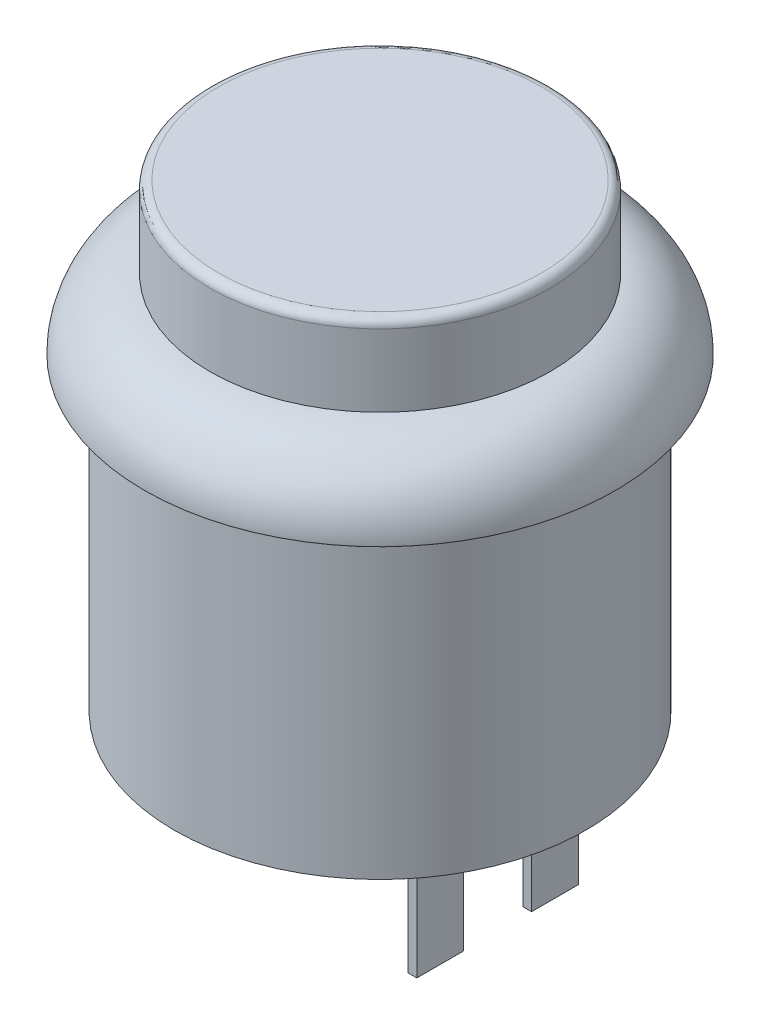
ISO-10303-21;
HEADER;
FILE_DESCRIPTION(('STEP AP214'),'2;1');
FILE_NAME('part.step','',(''),(''),'','','');
FILE_SCHEMA(('AUTOMOTIVE_DESIGN { 1 0 10303 214 1 1 1 1 }'));
ENDSEC;
DATA;
#1=APPLICATION_CONTEXT('core data for automotive mechanical design processes');
#2=APPLICATION_PROTOCOL_DEFINITION('international standard','automotive_design',2000,#1);
#3=PRODUCT_CONTEXT('',#1,'mechanical');
#4=PRODUCT('Part','Part','',(#3));
#5=PRODUCT_RELATED_PRODUCT_CATEGORY('part','',(#4));
#6=PRODUCT_DEFINITION_FORMATION('','',#4);
#7=PRODUCT_DEFINITION_CONTEXT('part definition',#1,'design');
#8=PRODUCT_DEFINITION('design','',#6,#7);
#9=PRODUCT_DEFINITION_SHAPE('','',#8);
#10=(LENGTH_UNIT() NAMED_UNIT(*) SI_UNIT(.MILLI.,.METRE.));
#11=(NAMED_UNIT(*) PLANE_ANGLE_UNIT() SI_UNIT($,.RADIAN.));
#12=(NAMED_UNIT(*) SI_UNIT($,.STERADIAN.) SOLID_ANGLE_UNIT());
#13=UNCERTAINTY_MEASURE_WITH_UNIT(LENGTH_MEASURE(1.E-05),#10,'distance_accuracy_value','');
#14=(GEOMETRIC_REPRESENTATION_CONTEXT(3) GLOBAL_UNCERTAINTY_ASSIGNED_CONTEXT((#13)) GLOBAL_UNIT_ASSIGNED_CONTEXT((#10,
#11,#12)) REPRESENTATION_CONTEXT('',''));
#15=CARTESIAN_POINT('',(0.,0.,0.));
#16=DIRECTION('',(0.,0.,1.));
#17=DIRECTION('',(1.,0.,0.));
#18=AXIS2_PLACEMENT_3D('',#15,#16,#17);
#19=CARTESIAN_POINT('',(0.,0.,0.));
#20=DIRECTION('',(0.,1.,0.));
#21=DIRECTION('',(0.,0.,1.));
#22=AXIS2_PLACEMENT_3D('',#19,#20,#21);
#23=PLANE('',#22);
#24=DIRECTION('',(0.,0.,-1.));
#25=VECTOR('',#24,1.);
#26=CARTESIAN_POINT('',(6.2,0.,4.605));
#27=LINE('',#26,#25);
#28=CARTESIAN_POINT('',(6.2,0.,4.605));
#29=VERTEX_POINT('',#28);
#30=CARTESIAN_POINT('',(6.2,0.,1.935));
#31=VERTEX_POINT('',#30);
#32=EDGE_CURVE('E131',#29,#31,#27,.T.);
#33=ORIENTED_EDGE('',*,*,#32,.F.);
#34=DIRECTION('',(-1.,0.,0.));
#35=VECTOR('',#34,1.);
#36=CARTESIAN_POINT('',(6.2,0.,4.605));
#37=LINE('',#36,#35);
#38=CARTESIAN_POINT('',(6.7,0.,4.605));
#39=VERTEX_POINT('',#38);
#40=EDGE_CURVE('E147',#39,#29,#37,.T.);
#41=ORIENTED_EDGE('',*,*,#40,.F.);
#42=DIRECTION('',(0.,0.,1.));
#43=VECTOR('',#42,1.);
#44=CARTESIAN_POINT('',(6.7,0.,4.605));
#45=LINE('',#44,#43);
#46=CARTESIAN_POINT('',(6.7,0.,1.935));
#47=VERTEX_POINT('',#46);
#48=EDGE_CURVE('E160',#47,#39,#45,.T.);
#49=ORIENTED_EDGE('',*,*,#48,.F.);
#50=DIRECTION('',(1.,0.,0.));
#51=VECTOR('',#50,1.);
#52=CARTESIAN_POINT('',(6.2,0.,1.935));
#53=LINE('',#52,#51);
#54=EDGE_CURVE('E136',#31,#47,#53,.T.);
#55=ORIENTED_EDGE('',*,*,#54,.F.);
#56=EDGE_LOOP('',(#33,#41,#49,#55));
#57=FACE_BOUND('',#56,.T.);
#58=CARTESIAN_POINT('',(0.,0.,0.));
#59=DIRECTION('',(0.,1.,0.));
#60=DIRECTION('',(0.,0.,1.));
#61=AXIS2_PLACEMENT_3D('',#58,#59,#60);
#62=CIRCLE('',#61,11.735);
#63=CARTESIAN_POINT('',(0.,0.,11.735));
#64=VERTEX_POINT('',#63);
#65=EDGE_CURVE('E192',#64,#64,#62,.T.);
#66=ORIENTED_EDGE('',*,*,#65,.F.);
#67=EDGE_LOOP('',(#66));
#68=FACE_BOUND('',#67,.T.);
#69=DIRECTION('',(0.,0.,-1.));
#70=VECTOR('',#69,1.);
#71=CARTESIAN_POINT('',(6.2,0.,-1.94));
#72=LINE('',#71,#70);
#73=CARTESIAN_POINT('',(6.2,0.,-1.94));
#74=VERTEX_POINT('',#73);
#75=CARTESIAN_POINT('',(6.2,0.,-4.61));
#76=VERTEX_POINT('',#75);
#77=EDGE_CURVE('E129',#74,#76,#72,.T.);
#78=ORIENTED_EDGE('',*,*,#77,.F.);
#79=DIRECTION('',(-1.,0.,0.));
#80=VECTOR('',#79,1.);
#81=CARTESIAN_POINT('',(6.2,0.,-1.94));
#82=LINE('',#81,#80);
#83=CARTESIAN_POINT('',(6.7,0.,-1.94));
#84=VERTEX_POINT('',#83);
#85=EDGE_CURVE('E126',#84,#74,#82,.T.);
#86=ORIENTED_EDGE('',*,*,#85,.F.);
#87=DIRECTION('',(0.,0.,1.));
#88=VECTOR('',#87,1.);
#89=CARTESIAN_POINT('',(6.7,0.,-1.94));
#90=LINE('',#89,#88);
#91=CARTESIAN_POINT('',(6.7,0.,-4.61));
#92=VERTEX_POINT('',#91);
#93=EDGE_CURVE('E62',#92,#84,#90,.T.);
#94=ORIENTED_EDGE('',*,*,#93,.F.);
#95=DIRECTION('',(1.,0.,0.));
#96=VECTOR('',#95,1.);
#97=CARTESIAN_POINT('',(6.2,0.,-4.61));
#98=LINE('',#97,#96);
#99=EDGE_CURVE('E57',#76,#92,#98,.T.);
#100=ORIENTED_EDGE('',*,*,#99,.F.);
#101=EDGE_LOOP('',(#78,#86,#94,#100));
#102=FACE_BOUND('',#101,.T.);
#103=ADVANCED_FACE('F41',(#57,#68,#102),#23,.F.);
#104=CARTESIAN_POINT('',(0.,17.64,0.));
#105=DIRECTION('',(0.,-1.,0.));
#106=DIRECTION('',(0.,0.,-1.));
#107=AXIS2_PLACEMENT_3D('',#104,#105,#106);
#108=CYLINDRICAL_SURFACE('',#107,11.735);
#109=CARTESIAN_POINT('',(0.,17.64,0.));
#110=DIRECTION('',(0.,1.,0.));
#111=DIRECTION('',(0.,0.,1.));
#112=AXIS2_PLACEMENT_3D('',#109,#110,#111);
#113=CIRCLE('',#112,11.735);
#114=CARTESIAN_POINT('',(0.,17.64,11.735));
#115=VERTEX_POINT('',#114);
#116=EDGE_CURVE('E188',#115,#115,#113,.T.);
#117=ORIENTED_EDGE('',*,*,#116,.F.);
#118=EDGE_LOOP('',(#117));
#119=FACE_BOUND('',#118,.T.);
#120=ORIENTED_EDGE('',*,*,#65,.T.);
#121=EDGE_LOOP('',(#120));
#122=FACE_BOUND('',#121,.T.);
#123=ADVANCED_FACE('F221',(#119,#122),#108,.T.);
#124=CARTESIAN_POINT('',(0.,21.64,0.));
#125=DIRECTION('',(0.,-1.,0.));
#126=DIRECTION('',(0.,0.,-1.));
#127=AXIS2_PLACEMENT_3D('',#124,#125,#126);
#128=CYLINDRICAL_SURFACE('',#127,13.44);
#129=CARTESIAN_POINT('',(0.,17.6487877781306,0.));
#130=DIRECTION('',(0.,1.,0.));
#131=DIRECTION('',(0.,0.,1.));
#132=AXIS2_PLACEMENT_3D('',#129,#130,#131);
#133=CIRCLE('',#132,13.44);
#134=CARTESIAN_POINT('',(0.,17.6487877781306,13.44));
#135=VERTEX_POINT('',#134);
#136=EDGE_CURVE('E187',#135,#135,#133,.F.);
#137=ORIENTED_EDGE('',*,*,#136,.T.);
#138=EDGE_LOOP('',(#137));
#139=FACE_BOUND('',#138,.T.);
#140=CARTESIAN_POINT('',(0.,17.64,0.));
#141=DIRECTION('',(0.,1.,0.));
#142=DIRECTION('',(0.,0.,1.));
#143=AXIS2_PLACEMENT_3D('',#140,#141,#142);
#144=CIRCLE('',#143,13.44);
#145=CARTESIAN_POINT('',(0.,17.64,13.44));
#146=VERTEX_POINT('',#145);
#147=EDGE_CURVE('E182',#146,#146,#144,.T.);
#148=ORIENTED_EDGE('',*,*,#147,.T.);
#149=EDGE_LOOP('',(#148));
#150=FACE_BOUND('',#149,.T.);
#151=ADVANCED_FACE('F227',(#139,#150),#128,.T.);
#152=CARTESIAN_POINT('',(0.,17.64,0.));
#153=DIRECTION('',(0.,1.,0.));
#154=DIRECTION('',(0.,0.,1.));
#155=AXIS2_PLACEMENT_3D('',#152,#153,#154);
#156=PLANE('',#155);
#157=ORIENTED_EDGE('',*,*,#116,.T.);
#158=EDGE_LOOP('',(#157));
#159=FACE_BOUND('',#158,.T.);
#160=ORIENTED_EDGE('',*,*,#147,.F.);
#161=EDGE_LOOP('',(#160));
#162=FACE_BOUND('',#161,.T.);
#163=ADVANCED_FACE('F234',(#159,#162),#156,.F.);
#164=CARTESIAN_POINT('',(0.,26.26,0.));
#165=DIRECTION('',(0.,-1.,0.));
#166=DIRECTION('',(0.,0.,-1.));
#167=AXIS2_PLACEMENT_3D('',#164,#165,#166);
#168=CYLINDRICAL_SURFACE('',#167,9.705);
#169=CARTESIAN_POINT('',(0.,25.76,0.));
#170=DIRECTION('',(0.,1.,0.));
#171=DIRECTION('',(0.,0.,1.));
#172=AXIS2_PLACEMENT_3D('',#169,#170,#171);
#173=CIRCLE('',#172,9.705);
#174=CARTESIAN_POINT('',(0.,25.76,9.705));
#175=VERTEX_POINT('',#174);
#176=EDGE_CURVE('E11',#175,#175,#173,.F.);
#177=ORIENTED_EDGE('',*,*,#176,.T.);
#178=EDGE_LOOP('',(#177));
#179=FACE_BOUND('',#178,.T.);
#180=CARTESIAN_POINT('',(0.,21.64,0.));
#181=DIRECTION('',(0.,1.,0.));
#182=DIRECTION('',(0.,0.,1.));
#183=AXIS2_PLACEMENT_3D('',#180,#181,#182);
#184=CIRCLE('',#183,9.705);
#185=CARTESIAN_POINT('',(0.,21.64,9.705));
#186=VERTEX_POINT('',#185);
#187=EDGE_CURVE('E183',#186,#186,#184,.T.);
#188=ORIENTED_EDGE('',*,*,#187,.T.);
#189=EDGE_LOOP('',(#188));
#190=FACE_BOUND('',#189,.T.);
#191=ADVANCED_FACE('F238',(#179,#190),#168,.T.);
#192=CARTESIAN_POINT('',(0.,26.26,0.));
#193=DIRECTION('',(0.,1.,0.));
#194=DIRECTION('',(0.,0.,1.));
#195=AXIS2_PLACEMENT_3D('',#192,#193,#194);
#196=PLANE('',#195);
#197=CARTESIAN_POINT('',(0.,26.26,0.));
#198=DIRECTION('',(0.,1.,0.));
#199=DIRECTION('',(0.,0.,1.));
#200=AXIS2_PLACEMENT_3D('',#197,#198,#199);
#201=CIRCLE('',#200,9.205);
#202=CARTESIAN_POINT('',(0.,26.26,9.205));
#203=VERTEX_POINT('',#202);
#204=EDGE_CURVE('E50',#203,#203,#201,.T.);
#205=ORIENTED_EDGE('',*,*,#204,.T.);
#206=EDGE_LOOP('',(#205));
#207=FACE_BOUND('',#206,.T.);
#208=ADVANCED_FACE('F205',(#207),#196,.T.);
#209=CARTESIAN_POINT('',(0.,17.6487877781306,0.));
#210=DIRECTION('',(0.,1.,0.));
#211=DIRECTION('',(0.,0.,1.));
#212=AXIS2_PLACEMENT_3D('',#209,#210,#211);
#213=TOROIDAL_SURFACE('',#212,9.44,4.);
#214=ORIENTED_EDGE('',*,*,#136,.F.);
#215=EDGE_LOOP('',(#214));
#216=FACE_BOUND('',#215,.T.);
#217=ORIENTED_EDGE('',*,*,#187,.F.);
#218=EDGE_LOOP('',(#217));
#219=FACE_BOUND('',#218,.T.);
#220=ADVANCED_FACE('F209',(#216,#219),#213,.T.);
#221=CARTESIAN_POINT('',(0.,25.76,0.));
#222=DIRECTION('',(0.,1.,0.));
#223=DIRECTION('',(0.,0.,1.));
#224=AXIS2_PLACEMENT_3D('',#221,#222,#223);
#225=TOROIDAL_SURFACE('',#224,9.205,0.5);
#226=ORIENTED_EDGE('',*,*,#176,.F.);
#227=EDGE_LOOP('',(#226));
#228=FACE_BOUND('',#227,.T.);
#229=ORIENTED_EDGE('',*,*,#204,.F.);
#230=EDGE_LOOP('',(#229));
#231=FACE_BOUND('',#230,.T.);
#232=ADVANCED_FACE('F43',(#228,#231),#225,.T.);
#233=CARTESIAN_POINT('',(6.2,-7.51,4.605));
#234=DIRECTION('',(1.,0.,0.));
#235=DIRECTION('',(0.,0.,-1.));
#236=AXIS2_PLACEMENT_3D('',#233,#234,#235);
#237=PLANE('',#236);
#238=ORIENTED_EDGE('',*,*,#32,.T.);
#239=DIRECTION('',(0.,1.,0.));
#240=VECTOR('',#239,1.);
#241=CARTESIAN_POINT('',(6.2,-7.51,1.935));
#242=LINE('',#241,#240);
#243=CARTESIAN_POINT('',(6.2,-7.51,1.935));
#244=VERTEX_POINT('',#243);
#245=EDGE_CURVE('E178',#244,#31,#242,.T.);
#246=ORIENTED_EDGE('',*,*,#245,.F.);
#247=DIRECTION('',(0.,0.,-1.));
#248=VECTOR('',#247,1.);
#249=CARTESIAN_POINT('',(6.2,-7.51,4.605));
#250=LINE('',#249,#248);
#251=CARTESIAN_POINT('',(6.2,-7.51,4.605));
#252=VERTEX_POINT('',#251);
#253=EDGE_CURVE('E142',#252,#244,#250,.T.);
#254=ORIENTED_EDGE('',*,*,#253,.F.);
#255=DIRECTION('',(0.,1.,0.));
#256=VECTOR('',#255,1.);
#257=CARTESIAN_POINT('',(6.2,-7.51,4.605));
#258=LINE('',#257,#256);
#259=EDGE_CURVE('E155',#252,#29,#258,.T.);
#260=ORIENTED_EDGE('',*,*,#259,.T.);
#261=EDGE_LOOP('',(#238,#246,#254,#260));
#262=FACE_BOUND('',#261,.T.);
#263=ADVANCED_FACE('F208',(#262),#237,.F.);
#264=CARTESIAN_POINT('',(6.2,-7.51,1.935));
#265=DIRECTION('',(0.,0.,1.));
#266=DIRECTION('',(1.,0.,0.));
#267=AXIS2_PLACEMENT_3D('',#264,#265,#266);
#268=PLANE('',#267);
#269=ORIENTED_EDGE('',*,*,#54,.T.);
#270=DIRECTION('',(0.,1.,0.));
#271=VECTOR('',#270,1.);
#272=CARTESIAN_POINT('',(6.7,-7.51,1.935));
#273=LINE('',#272,#271);
#274=CARTESIAN_POINT('',(6.7,-7.51,1.935));
#275=VERTEX_POINT('',#274);
#276=EDGE_CURVE('E174',#275,#47,#273,.T.);
#277=ORIENTED_EDGE('',*,*,#276,.F.);
#278=DIRECTION('',(1.,0.,0.));
#279=VECTOR('',#278,1.);
#280=CARTESIAN_POINT('',(6.2,-7.51,1.935));
#281=LINE('',#280,#279);
#282=EDGE_CURVE('E146',#244,#275,#281,.T.);
#283=ORIENTED_EDGE('',*,*,#282,.F.);
#284=ORIENTED_EDGE('',*,*,#245,.T.);
#285=EDGE_LOOP('',(#269,#277,#283,#284));
#286=FACE_BOUND('',#285,.T.);
#287=ADVANCED_FACE('F215',(#286),#268,.F.);
#288=CARTESIAN_POINT('',(6.7,-7.51,4.605));
#289=DIRECTION('',(-1.,0.,0.));
#290=DIRECTION('',(0.,0.,1.));
#291=AXIS2_PLACEMENT_3D('',#288,#289,#290);
#292=PLANE('',#291);
#293=ORIENTED_EDGE('',*,*,#48,.T.);
#294=DIRECTION('',(0.,1.,0.));
#295=VECTOR('',#294,1.);
#296=CARTESIAN_POINT('',(6.7,-7.51,4.605));
#297=LINE('',#296,#295);
#298=CARTESIAN_POINT('',(6.7,-7.51,4.605));
#299=VERTEX_POINT('',#298);
#300=EDGE_CURVE('E170',#299,#39,#297,.T.);
#301=ORIENTED_EDGE('',*,*,#300,.F.);
#302=DIRECTION('',(0.,0.,1.));
#303=VECTOR('',#302,1.);
#304=CARTESIAN_POINT('',(6.7,-7.51,4.605));
#305=LINE('',#304,#303);
#306=EDGE_CURVE('E150',#275,#299,#305,.T.);
#307=ORIENTED_EDGE('',*,*,#306,.F.);
#308=ORIENTED_EDGE('',*,*,#276,.T.);
#309=EDGE_LOOP('',(#293,#301,#307,#308));
#310=FACE_BOUND('',#309,.T.);
#311=ADVANCED_FACE('F247',(#310),#292,.F.);
#312=CARTESIAN_POINT('',(6.2,-7.51,4.605));
#313=DIRECTION('',(0.,0.,-1.));
#314=DIRECTION('',(-1.,0.,0.));
#315=AXIS2_PLACEMENT_3D('',#312,#313,#314);
#316=PLANE('',#315);
#317=ORIENTED_EDGE('',*,*,#40,.T.);
#318=ORIENTED_EDGE('',*,*,#259,.F.);
#319=DIRECTION('',(-1.,0.,0.));
#320=VECTOR('',#319,1.);
#321=CARTESIAN_POINT('',(6.2,-7.51,4.605));
#322=LINE('',#321,#320);
#323=EDGE_CURVE('E153',#299,#252,#322,.T.);
#324=ORIENTED_EDGE('',*,*,#323,.F.);
#325=ORIENTED_EDGE('',*,*,#300,.T.);
#326=EDGE_LOOP('',(#317,#318,#324,#325));
#327=FACE_BOUND('',#326,.T.);
#328=ADVANCED_FACE('F251',(#327),#316,.F.);
#329=CARTESIAN_POINT('',(0.,-7.51,0.));
#330=DIRECTION('',(0.,-1.,0.));
#331=DIRECTION('',(0.,0.,-1.));
#332=AXIS2_PLACEMENT_3D('',#329,#330,#331);
#333=PLANE('',#332);
#334=ORIENTED_EDGE('',*,*,#253,.T.);
#335=ORIENTED_EDGE('',*,*,#282,.T.);
#336=ORIENTED_EDGE('',*,*,#306,.T.);
#337=ORIENTED_EDGE('',*,*,#323,.T.);
#338=EDGE_LOOP('',(#334,#335,#336,#337));
#339=FACE_BOUND('',#338,.T.);
#340=ADVANCED_FACE('F255',(#339),#333,.T.);
#341=CARTESIAN_POINT('',(6.2,-7.51,-1.94));
#342=DIRECTION('',(1.,0.,0.));
#343=DIRECTION('',(0.,0.,-1.));
#344=AXIS2_PLACEMENT_3D('',#341,#342,#343);
#345=PLANE('',#344);
#346=ORIENTED_EDGE('',*,*,#77,.T.);
#347=DIRECTION('',(0.,1.,0.));
#348=VECTOR('',#347,1.);
#349=CARTESIAN_POINT('',(6.2,-7.51,-4.61));
#350=LINE('',#349,#348);
#351=CARTESIAN_POINT('',(6.2,-7.51,-4.61));
#352=VERTEX_POINT('',#351);
#353=EDGE_CURVE('E108',#352,#76,#350,.T.);
#354=ORIENTED_EDGE('',*,*,#353,.F.);
#355=DIRECTION('',(0.,0.,-1.));
#356=VECTOR('',#355,1.);
#357=CARTESIAN_POINT('',(6.2,-7.51,-1.94));
#358=LINE('',#357,#356);
#359=CARTESIAN_POINT('',(6.2,-7.51,-1.94));
#360=VERTEX_POINT('',#359);
#361=EDGE_CURVE('E116',#360,#352,#358,.T.);
#362=ORIENTED_EDGE('',*,*,#361,.F.);
#363=DIRECTION('',(0.,1.,0.));
#364=VECTOR('',#363,1.);
#365=CARTESIAN_POINT('',(6.2,-7.51,-1.94));
#366=LINE('',#365,#364);
#367=EDGE_CURVE('E379',#360,#74,#366,.T.);
#368=ORIENTED_EDGE('',*,*,#367,.T.);
#369=EDGE_LOOP('',(#346,#354,#362,#368));
#370=FACE_BOUND('',#369,.T.);
#371=ADVANCED_FACE('F128',(#370),#345,.F.);
#372=CARTESIAN_POINT('',(6.2,-7.51,-4.61));
#373=DIRECTION('',(0.,0.,1.));
#374=DIRECTION('',(1.,0.,0.));
#375=AXIS2_PLACEMENT_3D('',#372,#373,#374);
#376=PLANE('',#375);
#377=ORIENTED_EDGE('',*,*,#99,.T.);
#378=DIRECTION('',(0.,1.,0.));
#379=VECTOR('',#378,1.);
#380=CARTESIAN_POINT('',(6.7,-7.51,-4.61));
#381=LINE('',#380,#379);
#382=CARTESIAN_POINT('',(6.7,-7.51,-4.61));
#383=VERTEX_POINT('',#382);
#384=EDGE_CURVE('E111',#383,#92,#381,.T.);
#385=ORIENTED_EDGE('',*,*,#384,.F.);
#386=DIRECTION('',(1.,0.,0.));
#387=VECTOR('',#386,1.);
#388=CARTESIAN_POINT('',(6.2,-7.51,-4.61));
#389=LINE('',#388,#387);
#390=EDGE_CURVE('E104',#352,#383,#389,.T.);
#391=ORIENTED_EDGE('',*,*,#390,.F.);
#392=ORIENTED_EDGE('',*,*,#353,.T.);
#393=EDGE_LOOP('',(#377,#385,#391,#392));
#394=FACE_BOUND('',#393,.T.);
#395=ADVANCED_FACE('F106',(#394),#376,.F.);
#396=CARTESIAN_POINT('',(6.7,-7.51,-1.94));
#397=DIRECTION('',(-1.,0.,0.));
#398=DIRECTION('',(0.,0.,1.));
#399=AXIS2_PLACEMENT_3D('',#396,#397,#398);
#400=PLANE('',#399);
#401=ORIENTED_EDGE('',*,*,#93,.T.);
#402=DIRECTION('',(0.,1.,0.));
#403=VECTOR('',#402,1.);
#404=CARTESIAN_POINT('',(6.7,-7.51,-1.94));
#405=LINE('',#404,#403);
#406=CARTESIAN_POINT('',(6.7,-7.51,-1.94));
#407=VERTEX_POINT('',#406);
#408=EDGE_CURVE('E138',#407,#84,#405,.T.);
#409=ORIENTED_EDGE('',*,*,#408,.F.);
#410=DIRECTION('',(0.,0.,1.));
#411=VECTOR('',#410,1.);
#412=CARTESIAN_POINT('',(6.7,-7.51,-1.94));
#413=LINE('',#412,#411);
#414=EDGE_CURVE('E115',#383,#407,#413,.T.);
#415=ORIENTED_EDGE('',*,*,#414,.F.);
#416=ORIENTED_EDGE('',*,*,#384,.T.);
#417=EDGE_LOOP('',(#401,#409,#415,#416));
#418=FACE_BOUND('',#417,.T.);
#419=ADVANCED_FACE('F264',(#418),#400,.F.);
#420=CARTESIAN_POINT('',(6.2,-7.51,-1.94));
#421=DIRECTION('',(0.,0.,-1.));
#422=DIRECTION('',(-1.,0.,0.));
#423=AXIS2_PLACEMENT_3D('',#420,#421,#422);
#424=PLANE('',#423);
#425=ORIENTED_EDGE('',*,*,#85,.T.);
#426=ORIENTED_EDGE('',*,*,#367,.F.);
#427=DIRECTION('',(-1.,0.,0.));
#428=VECTOR('',#427,1.);
#429=CARTESIAN_POINT('',(6.2,-7.51,-1.94));
#430=LINE('',#429,#428);
#431=EDGE_CURVE('E121',#407,#360,#430,.T.);
#432=ORIENTED_EDGE('',*,*,#431,.F.);
#433=ORIENTED_EDGE('',*,*,#408,.T.);
#434=EDGE_LOOP('',(#425,#426,#432,#433));
#435=FACE_BOUND('',#434,.T.);
#436=ADVANCED_FACE('F267',(#435),#424,.F.);
#437=CARTESIAN_POINT('',(0.,-7.51,0.));
#438=DIRECTION('',(0.,-1.,0.));
#439=DIRECTION('',(0.,0.,-1.));
#440=AXIS2_PLACEMENT_3D('',#437,#438,#439);
#441=PLANE('',#440);
#442=ORIENTED_EDGE('',*,*,#361,.T.);
#443=ORIENTED_EDGE('',*,*,#390,.T.);
#444=ORIENTED_EDGE('',*,*,#414,.T.);
#445=ORIENTED_EDGE('',*,*,#431,.T.);
#446=EDGE_LOOP('',(#442,#443,#444,#445));
#447=FACE_BOUND('',#446,.T.);
#448=ADVANCED_FACE('F119',(#447),#441,.T.);
#449=CLOSED_SHELL('',(#103,#123,#151,#163,#191,#208,#220,#232,#263,#287,#311,#328,#340,#371,
#395,#419,#436,#448));
#450=MANIFOLD_SOLID_BREP('B2',#449);
#451=ADVANCED_BREP_SHAPE_REPRESENTATION('',(#18,#450),#14);
#452=SHAPE_DEFINITION_REPRESENTATION(#9,#451);
ENDSEC;
END-ISO-10303-21;
